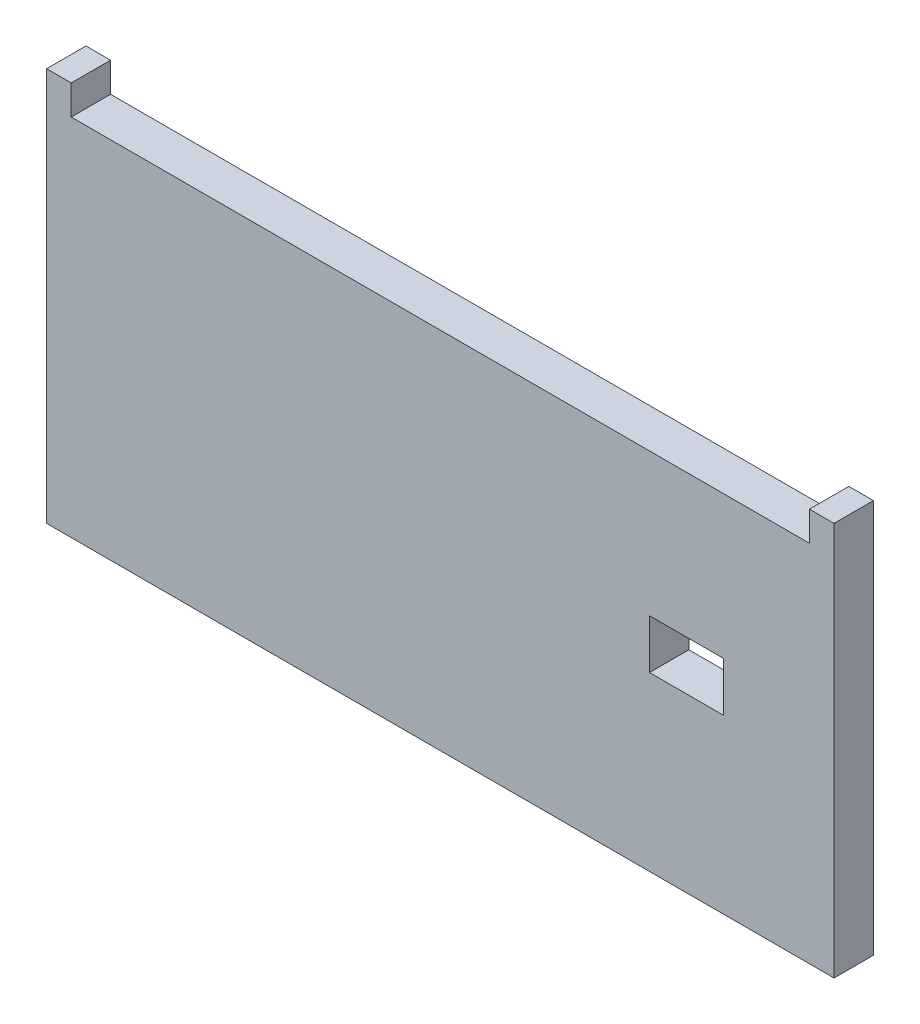
ISO-10303-21;
HEADER;
FILE_DESCRIPTION(('STEP AP214'),'2;1');
FILE_NAME('part.step','',(''),(''),'','','');
FILE_SCHEMA(('AUTOMOTIVE_DESIGN { 1 0 10303 214 1 1 1 1 }'));
ENDSEC;
DATA;
#1=APPLICATION_CONTEXT('core data for automotive mechanical design processes');
#2=APPLICATION_PROTOCOL_DEFINITION('international standard','automotive_design',2000,#1);
#3=PRODUCT_CONTEXT('',#1,'mechanical');
#4=PRODUCT('Part','Part','',(#3));
#5=PRODUCT_RELATED_PRODUCT_CATEGORY('part','',(#4));
#6=PRODUCT_DEFINITION_FORMATION('','',#4);
#7=PRODUCT_DEFINITION_CONTEXT('part definition',#1,'design');
#8=PRODUCT_DEFINITION('design','',#6,#7);
#9=PRODUCT_DEFINITION_SHAPE('','',#8);
#10=(LENGTH_UNIT() NAMED_UNIT(*) SI_UNIT(.MILLI.,.METRE.));
#11=(NAMED_UNIT(*) PLANE_ANGLE_UNIT() SI_UNIT($,.RADIAN.));
#12=(NAMED_UNIT(*) SI_UNIT($,.STERADIAN.) SOLID_ANGLE_UNIT());
#13=UNCERTAINTY_MEASURE_WITH_UNIT(LENGTH_MEASURE(1.E-05),#10,'distance_accuracy_value','');
#14=(GEOMETRIC_REPRESENTATION_CONTEXT(3) GLOBAL_UNCERTAINTY_ASSIGNED_CONTEXT((#13)) GLOBAL_UNIT_ASSIGNED_CONTEXT((#10,
#11,#12)) REPRESENTATION_CONTEXT('',''));
#15=CARTESIAN_POINT('',(0.,0.,0.));
#16=DIRECTION('',(0.,0.,1.));
#17=DIRECTION('',(1.,0.,0.));
#18=AXIS2_PLACEMENT_3D('',#15,#16,#17);
#19=CARTESIAN_POINT('',(-80.,40.,8.));
#20=DIRECTION('',(0.,-1.,0.));
#21=DIRECTION('',(0.,0.,-1.));
#22=AXIS2_PLACEMENT_3D('',#19,#20,#21);
#23=PLANE('',#22);
#24=DIRECTION('',(-1.,0.,0.));
#25=VECTOR('',#24,1.);
#26=CARTESIAN_POINT('',(-80.,40.,0.));
#27=LINE('',#26,#25);
#28=CARTESIAN_POINT('',(80.,40.,0.));
#29=VERTEX_POINT('',#28);
#30=CARTESIAN_POINT('',(75.,40.,0.));
#31=VERTEX_POINT('',#30);
#32=EDGE_CURVE('E201',#29,#31,#27,.T.);
#33=ORIENTED_EDGE('',*,*,#32,.T.);
#34=DIRECTION('',(0.,0.,-1.));
#35=VECTOR('',#34,1.);
#36=CARTESIAN_POINT('',(75.,40.,37.5));
#37=LINE('',#36,#35);
#38=CARTESIAN_POINT('',(75.,40.,8.));
#39=VERTEX_POINT('',#38);
#40=EDGE_CURVE('E163',#39,#31,#37,.T.);
#41=ORIENTED_EDGE('',*,*,#40,.F.);
#42=DIRECTION('',(-1.,0.,0.));
#43=VECTOR('',#42,1.);
#44=CARTESIAN_POINT('',(-80.,40.,8.));
#45=LINE('',#44,#43);
#46=CARTESIAN_POINT('',(80.,40.,8.));
#47=VERTEX_POINT('',#46);
#48=EDGE_CURVE('E190',#47,#39,#45,.T.);
#49=ORIENTED_EDGE('',*,*,#48,.F.);
#50=DIRECTION('',(0.,0.,-1.));
#51=VECTOR('',#50,1.);
#52=CARTESIAN_POINT('',(80.,40.,8.));
#53=LINE('',#52,#51);
#54=EDGE_CURVE('E215',#47,#29,#53,.T.);
#55=ORIENTED_EDGE('',*,*,#54,.T.);
#56=EDGE_LOOP('',(#33,#41,#49,#55));
#57=FACE_BOUND('',#56,.T.);
#58=ADVANCED_FACE('F41',(#57),#23,.F.);
#59=CARTESIAN_POINT('',(80.,-40.,8.));
#60=DIRECTION('',(-1.,0.,0.));
#61=DIRECTION('',(0.,0.,1.));
#62=AXIS2_PLACEMENT_3D('',#59,#60,#61);
#63=PLANE('',#62);
#64=DIRECTION('',(0.,1.,0.));
#65=VECTOR('',#64,1.);
#66=CARTESIAN_POINT('',(80.,-40.,0.));
#67=LINE('',#66,#65);
#68=CARTESIAN_POINT('',(80.,-40.,0.));
#69=VERTEX_POINT('',#68);
#70=EDGE_CURVE('E184',#69,#29,#67,.T.);
#71=ORIENTED_EDGE('',*,*,#70,.T.);
#72=ORIENTED_EDGE('',*,*,#54,.F.);
#73=DIRECTION('',(0.,1.,0.));
#74=VECTOR('',#73,1.);
#75=CARTESIAN_POINT('',(80.,-40.,8.));
#76=LINE('',#75,#74);
#77=CARTESIAN_POINT('',(80.,-40.,8.));
#78=VERTEX_POINT('',#77);
#79=EDGE_CURVE('E185',#78,#47,#76,.T.);
#80=ORIENTED_EDGE('',*,*,#79,.F.);
#81=DIRECTION('',(0.,0.,-1.));
#82=VECTOR('',#81,1.);
#83=CARTESIAN_POINT('',(80.,-40.,8.));
#84=LINE('',#83,#82);
#85=EDGE_CURVE('E197',#78,#69,#84,.T.);
#86=ORIENTED_EDGE('',*,*,#85,.T.);
#87=EDGE_LOOP('',(#71,#72,#80,#86));
#88=FACE_BOUND('',#87,.T.);
#89=ADVANCED_FACE('F43',(#88),#63,.F.);
#90=CARTESIAN_POINT('',(-75.,40.,8.));
#91=VERTEX_POINT('',#90);
#92=CARTESIAN_POINT('',(-80.,40.,8.));
#93=VERTEX_POINT('',#92);
#94=EDGE_CURVE('E188',#91,#93,#45,.T.);
#95=ORIENTED_EDGE('',*,*,#94,.F.);
#96=DIRECTION('',(0.,0.,1.));
#97=VECTOR('',#96,1.);
#98=CARTESIAN_POINT('',(-75.,40.,37.5));
#99=LINE('',#98,#97);
#100=CARTESIAN_POINT('',(-75.,40.,0.));
#101=VERTEX_POINT('',#100);
#102=EDGE_CURVE('E170',#101,#91,#99,.T.);
#103=ORIENTED_EDGE('',*,*,#102,.F.);
#104=CARTESIAN_POINT('',(-80.,40.,0.));
#105=VERTEX_POINT('',#104);
#106=EDGE_CURVE('E200',#101,#105,#27,.T.);
#107=ORIENTED_EDGE('',*,*,#106,.T.);
#108=DIRECTION('',(0.,0.,-1.));
#109=VECTOR('',#108,1.);
#110=CARTESIAN_POINT('',(-80.,40.,8.));
#111=LINE('',#110,#109);
#112=EDGE_CURVE('E212',#93,#105,#111,.T.);
#113=ORIENTED_EDGE('',*,*,#112,.F.);
#114=EDGE_LOOP('',(#95,#103,#107,#113));
#115=FACE_BOUND('',#114,.T.);
#116=ADVANCED_FACE('F228',(#115),#23,.F.);
#117=CARTESIAN_POINT('',(-80.,-40.,8.));
#118=DIRECTION('',(1.,0.,0.));
#119=DIRECTION('',(0.,0.,-1.));
#120=AXIS2_PLACEMENT_3D('',#117,#118,#119);
#121=PLANE('',#120);
#122=DIRECTION('',(0.,-1.,0.));
#123=VECTOR('',#122,1.);
#124=CARTESIAN_POINT('',(-80.,-40.,0.));
#125=LINE('',#124,#123);
#126=CARTESIAN_POINT('',(-80.,-40.,0.));
#127=VERTEX_POINT('',#126);
#128=EDGE_CURVE('E204',#105,#127,#125,.T.);
#129=ORIENTED_EDGE('',*,*,#128,.T.);
#130=DIRECTION('',(0.,0.,-1.));
#131=VECTOR('',#130,1.);
#132=CARTESIAN_POINT('',(-80.,-40.,8.));
#133=LINE('',#132,#131);
#134=CARTESIAN_POINT('',(-80.,-40.,8.));
#135=VERTEX_POINT('',#134);
#136=EDGE_CURVE('E209',#135,#127,#133,.T.);
#137=ORIENTED_EDGE('',*,*,#136,.F.);
#138=DIRECTION('',(0.,-1.,0.));
#139=VECTOR('',#138,1.);
#140=CARTESIAN_POINT('',(-80.,-40.,8.));
#141=LINE('',#140,#139);
#142=EDGE_CURVE('E193',#93,#135,#141,.T.);
#143=ORIENTED_EDGE('',*,*,#142,.F.);
#144=ORIENTED_EDGE('',*,*,#112,.T.);
#145=EDGE_LOOP('',(#129,#137,#143,#144));
#146=FACE_BOUND('',#145,.T.);
#147=ADVANCED_FACE('F236',(#146),#121,.F.);
#148=CARTESIAN_POINT('',(-80.,-40.,8.));
#149=DIRECTION('',(0.,1.,0.));
#150=DIRECTION('',(0.,0.,1.));
#151=AXIS2_PLACEMENT_3D('',#148,#149,#150);
#152=PLANE('',#151);
#153=DIRECTION('',(1.,0.,0.));
#154=VECTOR('',#153,1.);
#155=CARTESIAN_POINT('',(-80.,-40.,0.));
#156=LINE('',#155,#154);
#157=EDGE_CURVE('E189',#127,#69,#156,.T.);
#158=ORIENTED_EDGE('',*,*,#157,.T.);
#159=ORIENTED_EDGE('',*,*,#85,.F.);
#160=DIRECTION('',(1.,0.,0.));
#161=VECTOR('',#160,1.);
#162=CARTESIAN_POINT('',(-80.,-40.,8.));
#163=LINE('',#162,#161);
#164=EDGE_CURVE('E195',#135,#78,#163,.T.);
#165=ORIENTED_EDGE('',*,*,#164,.F.);
#166=ORIENTED_EDGE('',*,*,#136,.T.);
#167=EDGE_LOOP('',(#158,#159,#165,#166));
#168=FACE_BOUND('',#167,.T.);
#169=ADVANCED_FACE('F240',(#168),#152,.F.);
#170=CARTESIAN_POINT('',(0.,0.,8.));
#171=DIRECTION('',(0.,0.,-1.));
#172=DIRECTION('',(-1.,0.,0.));
#173=AXIS2_PLACEMENT_3D('',#170,#171,#172);
#174=PLANE('',#173);
#175=DIRECTION('',(-1.,0.,0.));
#176=VECTOR('',#175,1.);
#177=CARTESIAN_POINT('',(42.5,5.,8.));
#178=LINE('',#177,#176);
#179=CARTESIAN_POINT('',(57.5,5.,8.));
#180=VERTEX_POINT('',#179);
#181=CARTESIAN_POINT('',(42.5,5.,8.));
#182=VERTEX_POINT('',#181);
#183=EDGE_CURVE('E157',#180,#182,#178,.T.);
#184=ORIENTED_EDGE('',*,*,#183,.F.);
#185=DIRECTION('',(0.,1.,0.));
#186=VECTOR('',#185,1.);
#187=CARTESIAN_POINT('',(57.5,-5.,8.));
#188=LINE('',#187,#186);
#189=CARTESIAN_POINT('',(57.5,-5.,8.));
#190=VERTEX_POINT('',#189);
#191=EDGE_CURVE('E56',#190,#180,#188,.T.);
#192=ORIENTED_EDGE('',*,*,#191,.F.);
#193=DIRECTION('',(1.,0.,0.));
#194=VECTOR('',#193,1.);
#195=CARTESIAN_POINT('',(42.5,-5.,8.));
#196=LINE('',#195,#194);
#197=CARTESIAN_POINT('',(42.5,-5.,8.));
#198=VERTEX_POINT('',#197);
#199=EDGE_CURVE('E148',#198,#190,#196,.T.);
#200=ORIENTED_EDGE('',*,*,#199,.F.);
#201=DIRECTION('',(0.,-1.,0.));
#202=VECTOR('',#201,1.);
#203=CARTESIAN_POINT('',(42.5,-5.,8.));
#204=LINE('',#203,#202);
#205=EDGE_CURVE('E151',#182,#198,#204,.T.);
#206=ORIENTED_EDGE('',*,*,#205,.F.);
#207=EDGE_LOOP('',(#184,#192,#200,#206));
#208=FACE_BOUND('',#207,.T.);
#209=ORIENTED_EDGE('',*,*,#48,.T.);
#210=DIRECTION('',(0.,-1.,0.));
#211=VECTOR('',#210,1.);
#212=CARTESIAN_POINT('',(75.,0.,8.));
#213=LINE('',#212,#211);
#214=CARTESIAN_POINT('',(75.,34.,8.));
#215=VERTEX_POINT('',#214);
#216=EDGE_CURVE('E181',#39,#215,#213,.T.);
#217=ORIENTED_EDGE('',*,*,#216,.T.);
#218=DIRECTION('',(-1.,0.,0.));
#219=VECTOR('',#218,1.);
#220=CARTESIAN_POINT('',(0.,34.,8.));
#221=LINE('',#220,#219);
#222=CARTESIAN_POINT('',(-75.,34.,8.));
#223=VERTEX_POINT('',#222);
#224=EDGE_CURVE('E173',#215,#223,#221,.T.);
#225=ORIENTED_EDGE('',*,*,#224,.T.);
#226=DIRECTION('',(0.,1.,0.));
#227=VECTOR('',#226,1.);
#228=CARTESIAN_POINT('',(-75.,0.,8.));
#229=LINE('',#228,#227);
#230=EDGE_CURVE('E178',#223,#91,#229,.T.);
#231=ORIENTED_EDGE('',*,*,#230,.T.);
#232=ORIENTED_EDGE('',*,*,#94,.T.);
#233=ORIENTED_EDGE('',*,*,#142,.T.);
#234=ORIENTED_EDGE('',*,*,#164,.T.);
#235=ORIENTED_EDGE('',*,*,#79,.T.);
#236=EDGE_LOOP('',(#209,#217,#225,#231,#232,#233,#234,#235));
#237=FACE_BOUND('',#236,.T.);
#238=ADVANCED_FACE('F244',(#208,#237),#174,.F.);
#239=CARTESIAN_POINT('',(0.,0.,0.));
#240=DIRECTION('',(0.,0.,-1.));
#241=DIRECTION('',(-1.,0.,0.));
#242=AXIS2_PLACEMENT_3D('',#239,#240,#241);
#243=PLANE('',#242);
#244=DIRECTION('',(0.,1.,0.));
#245=VECTOR('',#244,1.);
#246=CARTESIAN_POINT('',(57.5,-5.,0.));
#247=LINE('',#246,#245);
#248=CARTESIAN_POINT('',(57.5,-5.,0.));
#249=VERTEX_POINT('',#248);
#250=CARTESIAN_POINT('',(57.5,5.,0.));
#251=VERTEX_POINT('',#250);
#252=EDGE_CURVE('E132',#249,#251,#247,.T.);
#253=ORIENTED_EDGE('',*,*,#252,.T.);
#254=DIRECTION('',(-1.,0.,0.));
#255=VECTOR('',#254,1.);
#256=CARTESIAN_POINT('',(42.5,5.,0.));
#257=LINE('',#256,#255);
#258=CARTESIAN_POINT('',(42.5,5.,0.));
#259=VERTEX_POINT('',#258);
#260=EDGE_CURVE('E141',#251,#259,#257,.T.);
#261=ORIENTED_EDGE('',*,*,#260,.T.);
#262=DIRECTION('',(0.,-1.,0.));
#263=VECTOR('',#262,1.);
#264=CARTESIAN_POINT('',(42.5,-5.,0.));
#265=LINE('',#264,#263);
#266=CARTESIAN_POINT('',(42.5,-5.,0.));
#267=VERTEX_POINT('',#266);
#268=EDGE_CURVE('E64',#259,#267,#265,.T.);
#269=ORIENTED_EDGE('',*,*,#268,.T.);
#270=DIRECTION('',(1.,0.,0.));
#271=VECTOR('',#270,1.);
#272=CARTESIAN_POINT('',(42.5,-5.,0.));
#273=LINE('',#272,#271);
#274=EDGE_CURVE('E138',#267,#249,#273,.T.);
#275=ORIENTED_EDGE('',*,*,#274,.T.);
#276=EDGE_LOOP('',(#253,#261,#269,#275));
#277=FACE_BOUND('',#276,.T.);
#278=DIRECTION('',(0.,-1.,0.));
#279=VECTOR('',#278,1.);
#280=CARTESIAN_POINT('',(75.,0.,0.));
#281=LINE('',#280,#279);
#282=CARTESIAN_POINT('',(75.,34.,0.));
#283=VERTEX_POINT('',#282);
#284=EDGE_CURVE('E11',#31,#283,#281,.T.);
#285=ORIENTED_EDGE('',*,*,#284,.F.);
#286=ORIENTED_EDGE('',*,*,#32,.F.);
#287=ORIENTED_EDGE('',*,*,#70,.F.);
#288=ORIENTED_EDGE('',*,*,#157,.F.);
#289=ORIENTED_EDGE('',*,*,#128,.F.);
#290=ORIENTED_EDGE('',*,*,#106,.F.);
#291=DIRECTION('',(0.,1.,0.));
#292=VECTOR('',#291,1.);
#293=CARTESIAN_POINT('',(-75.,0.,0.));
#294=LINE('',#293,#292);
#295=CARTESIAN_POINT('',(-75.,34.,0.));
#296=VERTEX_POINT('',#295);
#297=EDGE_CURVE('E49',#296,#101,#294,.T.);
#298=ORIENTED_EDGE('',*,*,#297,.F.);
#299=DIRECTION('',(-1.,0.,0.));
#300=VECTOR('',#299,1.);
#301=CARTESIAN_POINT('',(0.,34.,0.));
#302=LINE('',#301,#300);
#303=EDGE_CURVE('E218',#283,#296,#302,.T.);
#304=ORIENTED_EDGE('',*,*,#303,.F.);
#305=EDGE_LOOP('',(#285,#286,#287,#288,#289,#290,#298,#304));
#306=FACE_BOUND('',#305,.T.);
#307=ADVANCED_FACE('F145',(#277,#306),#243,.T.);
#308=CARTESIAN_POINT('',(75.,34.,37.5));
#309=DIRECTION('',(1.,0.,0.));
#310=DIRECTION('',(0.,0.,-1.));
#311=AXIS2_PLACEMENT_3D('',#308,#309,#310);
#312=PLANE('',#311);
#313=ORIENTED_EDGE('',*,*,#40,.T.);
#314=ORIENTED_EDGE('',*,*,#284,.T.);
#315=DIRECTION('',(0.,0.,-1.));
#316=VECTOR('',#315,1.);
#317=CARTESIAN_POINT('',(75.,34.,37.5));
#318=LINE('',#317,#316);
#319=EDGE_CURVE('E167',#215,#283,#318,.T.);
#320=ORIENTED_EDGE('',*,*,#319,.F.);
#321=ORIENTED_EDGE('',*,*,#216,.F.);
#322=EDGE_LOOP('',(#313,#314,#320,#321));
#323=FACE_BOUND('',#322,.T.);
#324=ADVANCED_FACE('F267',(#323),#312,.F.);
#325=CARTESIAN_POINT('',(-75.,34.,37.5));
#326=DIRECTION('',(-1.,0.,0.));
#327=DIRECTION('',(0.,0.,1.));
#328=AXIS2_PLACEMENT_3D('',#325,#326,#327);
#329=PLANE('',#328);
#330=DIRECTION('',(0.,0.,1.));
#331=VECTOR('',#330,1.);
#332=CARTESIAN_POINT('',(-75.,34.,37.5));
#333=LINE('',#332,#331);
#334=EDGE_CURVE('E169',#296,#223,#333,.T.);
#335=ORIENTED_EDGE('',*,*,#334,.F.);
#336=ORIENTED_EDGE('',*,*,#297,.T.);
#337=ORIENTED_EDGE('',*,*,#102,.T.);
#338=ORIENTED_EDGE('',*,*,#230,.F.);
#339=EDGE_LOOP('',(#335,#336,#337,#338));
#340=FACE_BOUND('',#339,.T.);
#341=ADVANCED_FACE('F223',(#340),#329,.F.);
#342=CARTESIAN_POINT('',(0.,34.,0.));
#343=DIRECTION('',(0.,-1.,0.));
#344=DIRECTION('',(0.,0.,-1.));
#345=AXIS2_PLACEMENT_3D('',#342,#343,#344);
#346=PLANE('',#345);
#347=ORIENTED_EDGE('',*,*,#319,.T.);
#348=ORIENTED_EDGE('',*,*,#303,.T.);
#349=ORIENTED_EDGE('',*,*,#334,.T.);
#350=ORIENTED_EDGE('',*,*,#224,.F.);
#351=EDGE_LOOP('',(#347,#348,#349,#350));
#352=FACE_BOUND('',#351,.T.);
#353=ADVANCED_FACE('F247',(#352),#346,.F.);
#354=CARTESIAN_POINT('',(57.5,-5.,0.));
#355=DIRECTION('',(1.,0.,0.));
#356=DIRECTION('',(0.,0.,-1.));
#357=AXIS2_PLACEMENT_3D('',#354,#355,#356);
#358=PLANE('',#357);
#359=ORIENTED_EDGE('',*,*,#191,.T.);
#360=DIRECTION('',(0.,0.,1.));
#361=VECTOR('',#360,1.);
#362=CARTESIAN_POINT('',(57.5,5.,0.));
#363=LINE('',#362,#361);
#364=EDGE_CURVE('E128',#251,#180,#363,.T.);
#365=ORIENTED_EDGE('',*,*,#364,.F.);
#366=ORIENTED_EDGE('',*,*,#252,.F.);
#367=DIRECTION('',(0.,0.,1.));
#368=VECTOR('',#367,1.);
#369=CARTESIAN_POINT('',(57.5,-5.,0.));
#370=LINE('',#369,#368);
#371=EDGE_CURVE('E161',#249,#190,#370,.T.);
#372=ORIENTED_EDGE('',*,*,#371,.T.);
#373=EDGE_LOOP('',(#359,#365,#366,#372));
#374=FACE_BOUND('',#373,.T.);
#375=ADVANCED_FACE('F130',(#374),#358,.F.);
#376=CARTESIAN_POINT('',(42.5,-5.,0.));
#377=DIRECTION('',(0.,-1.,0.));
#378=DIRECTION('',(0.,0.,-1.));
#379=AXIS2_PLACEMENT_3D('',#376,#377,#378);
#380=PLANE('',#379);
#381=ORIENTED_EDGE('',*,*,#199,.T.);
#382=ORIENTED_EDGE('',*,*,#371,.F.);
#383=ORIENTED_EDGE('',*,*,#274,.F.);
#384=DIRECTION('',(0.,0.,1.));
#385=VECTOR('',#384,1.);
#386=CARTESIAN_POINT('',(42.5,-5.,0.));
#387=LINE('',#386,#385);
#388=EDGE_CURVE('E164',#267,#198,#387,.T.);
#389=ORIENTED_EDGE('',*,*,#388,.T.);
#390=EDGE_LOOP('',(#381,#382,#383,#389));
#391=FACE_BOUND('',#390,.T.);
#392=ADVANCED_FACE('F279',(#391),#380,.F.);
#393=CARTESIAN_POINT('',(42.5,-5.,0.));
#394=DIRECTION('',(-1.,0.,0.));
#395=DIRECTION('',(0.,0.,1.));
#396=AXIS2_PLACEMENT_3D('',#393,#394,#395);
#397=PLANE('',#396);
#398=ORIENTED_EDGE('',*,*,#205,.T.);
#399=ORIENTED_EDGE('',*,*,#388,.F.);
#400=ORIENTED_EDGE('',*,*,#268,.F.);
#401=DIRECTION('',(0.,0.,1.));
#402=VECTOR('',#401,1.);
#403=CARTESIAN_POINT('',(42.5,5.,0.));
#404=LINE('',#403,#402);
#405=EDGE_CURVE('E137',#259,#182,#404,.T.);
#406=ORIENTED_EDGE('',*,*,#405,.T.);
#407=EDGE_LOOP('',(#398,#399,#400,#406));
#408=FACE_BOUND('',#407,.T.);
#409=ADVANCED_FACE('F282',(#408),#397,.F.);
#410=CARTESIAN_POINT('',(42.5,5.,0.));
#411=DIRECTION('',(0.,1.,0.));
#412=DIRECTION('',(0.,0.,1.));
#413=AXIS2_PLACEMENT_3D('',#410,#411,#412);
#414=PLANE('',#413);
#415=ORIENTED_EDGE('',*,*,#183,.T.);
#416=ORIENTED_EDGE('',*,*,#405,.F.);
#417=ORIENTED_EDGE('',*,*,#260,.F.);
#418=ORIENTED_EDGE('',*,*,#364,.T.);
#419=EDGE_LOOP('',(#415,#416,#417,#418));
#420=FACE_BOUND('',#419,.T.);
#421=ADVANCED_FACE('F142',(#420),#414,.F.);
#422=CLOSED_SHELL('',(#58,#89,#116,#147,#169,#238,#307,#324,#341,#353,#375,#392,#409,#421));
#423=MANIFOLD_SOLID_BREP('B2',#422);
#424=ADVANCED_BREP_SHAPE_REPRESENTATION('',(#18,#423),#14);
#425=SHAPE_DEFINITION_REPRESENTATION(#9,#424);
ENDSEC;
END-ISO-10303-21;
